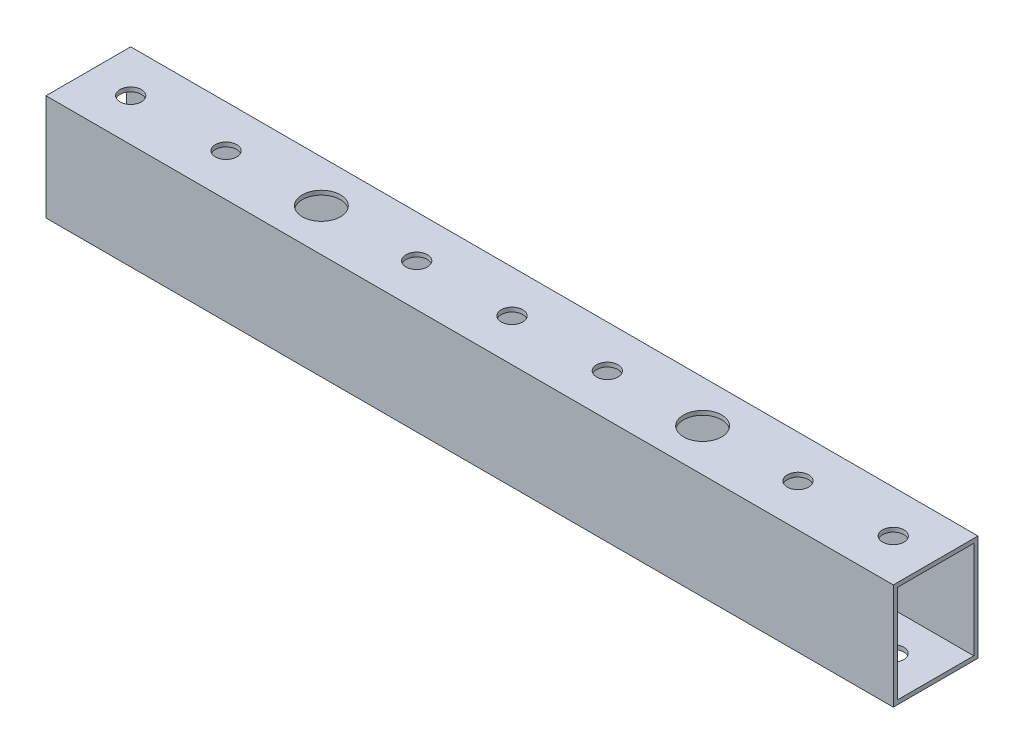
ISO-10303-21;
HEADER;
FILE_DESCRIPTION(('STEP AP214'),'2;1');
FILE_NAME('part.step','',(''),(''),'','','');
FILE_SCHEMA(('AUTOMOTIVE_DESIGN { 1 0 10303 214 1 1 1 1 }'));
ENDSEC;
DATA;
#1=APPLICATION_CONTEXT('core data for automotive mechanical design processes');
#2=APPLICATION_PROTOCOL_DEFINITION('international standard','automotive_design',2000,#1);
#3=PRODUCT_CONTEXT('',#1,'mechanical');
#4=PRODUCT('Part','Part','',(#3));
#5=PRODUCT_RELATED_PRODUCT_CATEGORY('part','',(#4));
#6=PRODUCT_DEFINITION_FORMATION('','',#4);
#7=PRODUCT_DEFINITION_CONTEXT('part definition',#1,'design');
#8=PRODUCT_DEFINITION('design','',#6,#7);
#9=PRODUCT_DEFINITION_SHAPE('','',#8);
#10=(LENGTH_UNIT() NAMED_UNIT(*) SI_UNIT(.MILLI.,.METRE.));
#11=(NAMED_UNIT(*) PLANE_ANGLE_UNIT() SI_UNIT($,.RADIAN.));
#12=(NAMED_UNIT(*) SI_UNIT($,.STERADIAN.) SOLID_ANGLE_UNIT());
#13=UNCERTAINTY_MEASURE_WITH_UNIT(LENGTH_MEASURE(1.E-05),#10,'distance_accuracy_value','');
#14=(GEOMETRIC_REPRESENTATION_CONTEXT(3) GLOBAL_UNCERTAINTY_ASSIGNED_CONTEXT((#13)) GLOBAL_UNIT_ASSIGNED_CONTEXT((#10,
#11,#12)) REPRESENTATION_CONTEXT('',''));
#15=CARTESIAN_POINT('',(0.,0.,0.));
#16=DIRECTION('',(0.,0.,1.));
#17=DIRECTION('',(1.,0.,0.));
#18=AXIS2_PLACEMENT_3D('',#15,#16,#17);
#19=CARTESIAN_POINT('',(100.,0.,0.));
#20=DIRECTION('',(1.,0.,0.));
#21=DIRECTION('',(0.,0.,-1.));
#22=AXIS2_PLACEMENT_3D('',#19,#20,#21);
#23=PLANE('',#22);
#24=DIRECTION('',(0.,0.,-1.));
#25=VECTOR('',#24,1.);
#26=CARTESIAN_POINT('',(100.,-12.5,10.));
#27=LINE('',#26,#25);
#28=CARTESIAN_POINT('',(100.,-12.5,10.));
#29=VERTEX_POINT('',#28);
#30=CARTESIAN_POINT('',(100.,-12.5,-10.));
#31=VERTEX_POINT('',#30);
#32=EDGE_CURVE('E143',#29,#31,#27,.T.);
#33=ORIENTED_EDGE('',*,*,#32,.T.);
#34=DIRECTION('',(0.,1.,0.));
#35=VECTOR('',#34,1.);
#36=CARTESIAN_POINT('',(100.,-12.5,-10.));
#37=LINE('',#36,#35);
#38=CARTESIAN_POINT('',(100.,12.5,-10.));
#39=VERTEX_POINT('',#38);
#40=EDGE_CURVE('E146',#31,#39,#37,.T.);
#41=ORIENTED_EDGE('',*,*,#40,.T.);
#42=DIRECTION('',(0.,0.,1.));
#43=VECTOR('',#42,1.);
#44=CARTESIAN_POINT('',(100.,12.5,10.));
#45=LINE('',#44,#43);
#46=CARTESIAN_POINT('',(100.,12.5,10.));
#47=VERTEX_POINT('',#46);
#48=EDGE_CURVE('E149',#39,#47,#45,.T.);
#49=ORIENTED_EDGE('',*,*,#48,.T.);
#50=DIRECTION('',(0.,-1.,0.));
#51=VECTOR('',#50,1.);
#52=CARTESIAN_POINT('',(100.,-12.5,10.));
#53=LINE('',#52,#51);
#54=EDGE_CURVE('E151',#47,#29,#53,.T.);
#55=ORIENTED_EDGE('',*,*,#54,.T.);
#56=EDGE_LOOP('',(#33,#41,#49,#55));
#57=FACE_BOUND('',#56,.T.);
#58=DIRECTION('',(0.,0.,1.));
#59=VECTOR('',#58,1.);
#60=CARTESIAN_POINT('',(100.,11.5,9.));
#61=LINE('',#60,#59);
#62=CARTESIAN_POINT('',(100.,11.5,-9.));
#63=VERTEX_POINT('',#62);
#64=CARTESIAN_POINT('',(100.,11.5,9.));
#65=VERTEX_POINT('',#64);
#66=EDGE_CURVE('E113',#63,#65,#61,.T.);
#67=ORIENTED_EDGE('',*,*,#66,.F.);
#68=DIRECTION('',(0.,1.,0.));
#69=VECTOR('',#68,1.);
#70=CARTESIAN_POINT('',(100.,-11.5,-9.));
#71=LINE('',#70,#69);
#72=CARTESIAN_POINT('',(100.,-11.5,-9.));
#73=VERTEX_POINT('',#72);
#74=EDGE_CURVE('E105',#73,#63,#71,.T.);
#75=ORIENTED_EDGE('',*,*,#74,.F.);
#76=DIRECTION('',(0.,0.,-1.));
#77=VECTOR('',#76,1.);
#78=CARTESIAN_POINT('',(100.,-11.5,9.));
#79=LINE('',#78,#77);
#80=CARTESIAN_POINT('',(100.,-11.5,9.));
#81=VERTEX_POINT('',#80);
#82=EDGE_CURVE('E127',#81,#73,#79,.T.);
#83=ORIENTED_EDGE('',*,*,#82,.F.);
#84=DIRECTION('',(0.,-1.,0.));
#85=VECTOR('',#84,1.);
#86=CARTESIAN_POINT('',(100.,-11.5,9.));
#87=LINE('',#86,#85);
#88=EDGE_CURVE('E125',#65,#81,#87,.T.);
#89=ORIENTED_EDGE('',*,*,#88,.F.);
#90=EDGE_LOOP('',(#67,#75,#83,#89));
#91=FACE_BOUND('',#90,.T.);
#92=ADVANCED_FACE('F38',(#57,#91),#23,.T.);
#93=CARTESIAN_POINT('',(-100.,0.,0.));
#94=DIRECTION('',(1.,0.,0.));
#95=DIRECTION('',(0.,0.,-1.));
#96=AXIS2_PLACEMENT_3D('',#93,#94,#95);
#97=PLANE('',#96);
#98=DIRECTION('',(0.,0.,-1.));
#99=VECTOR('',#98,1.);
#100=CARTESIAN_POINT('',(-100.,-12.5,10.));
#101=LINE('',#100,#99);
#102=CARTESIAN_POINT('',(-100.,-12.5,10.));
#103=VERTEX_POINT('',#102);
#104=CARTESIAN_POINT('',(-100.,-12.5,-10.));
#105=VERTEX_POINT('',#104);
#106=EDGE_CURVE('E121',#103,#105,#101,.T.);
#107=ORIENTED_EDGE('',*,*,#106,.F.);
#108=DIRECTION('',(0.,-1.,0.));
#109=VECTOR('',#108,1.);
#110=CARTESIAN_POINT('',(-100.,-12.5,10.));
#111=LINE('',#110,#109);
#112=CARTESIAN_POINT('',(-100.,12.5,10.));
#113=VERTEX_POINT('',#112);
#114=EDGE_CURVE('E147',#113,#103,#111,.T.);
#115=ORIENTED_EDGE('',*,*,#114,.F.);
#116=DIRECTION('',(0.,0.,1.));
#117=VECTOR('',#116,1.);
#118=CARTESIAN_POINT('',(-100.,12.5,10.));
#119=LINE('',#118,#117);
#120=CARTESIAN_POINT('',(-100.,12.5,-10.));
#121=VERTEX_POINT('',#120);
#122=EDGE_CURVE('E158',#121,#113,#119,.T.);
#123=ORIENTED_EDGE('',*,*,#122,.F.);
#124=DIRECTION('',(0.,1.,0.));
#125=VECTOR('',#124,1.);
#126=CARTESIAN_POINT('',(-100.,-12.5,-10.));
#127=LINE('',#126,#125);
#128=EDGE_CURVE('E156',#105,#121,#127,.T.);
#129=ORIENTED_EDGE('',*,*,#128,.F.);
#130=EDGE_LOOP('',(#107,#115,#123,#129));
#131=FACE_BOUND('',#130,.T.);
#132=DIRECTION('',(0.,1.,0.));
#133=VECTOR('',#132,1.);
#134=CARTESIAN_POINT('',(-100.,-11.5,-9.));
#135=LINE('',#134,#133);
#136=CARTESIAN_POINT('',(-100.,-11.5,-9.));
#137=VERTEX_POINT('',#136);
#138=CARTESIAN_POINT('',(-100.,11.5,-9.));
#139=VERTEX_POINT('',#138);
#140=EDGE_CURVE('E63',#137,#139,#135,.T.);
#141=ORIENTED_EDGE('',*,*,#140,.T.);
#142=DIRECTION('',(0.,0.,1.));
#143=VECTOR('',#142,1.);
#144=CARTESIAN_POINT('',(-100.,11.5,9.));
#145=LINE('',#144,#143);
#146=CARTESIAN_POINT('',(-100.,11.5,9.));
#147=VERTEX_POINT('',#146);
#148=EDGE_CURVE('E120',#139,#147,#145,.T.);
#149=ORIENTED_EDGE('',*,*,#148,.T.);
#150=DIRECTION('',(0.,-1.,0.));
#151=VECTOR('',#150,1.);
#152=CARTESIAN_POINT('',(-100.,-11.5,9.));
#153=LINE('',#152,#151);
#154=CARTESIAN_POINT('',(-100.,-11.5,9.));
#155=VERTEX_POINT('',#154);
#156=EDGE_CURVE('E135',#147,#155,#153,.T.);
#157=ORIENTED_EDGE('',*,*,#156,.T.);
#158=DIRECTION('',(0.,0.,-1.));
#159=VECTOR('',#158,1.);
#160=CARTESIAN_POINT('',(-100.,-11.5,9.));
#161=LINE('',#160,#159);
#162=EDGE_CURVE('E114',#155,#137,#161,.T.);
#163=ORIENTED_EDGE('',*,*,#162,.T.);
#164=EDGE_LOOP('',(#141,#149,#157,#163));
#165=FACE_BOUND('',#164,.T.);
#166=ADVANCED_FACE('F265',(#131,#165),#97,.F.);
#167=CARTESIAN_POINT('',(100.,-12.5,10.));
#168=DIRECTION('',(0.,1.,0.));
#169=DIRECTION('',(0.,0.,1.));
#170=AXIS2_PLACEMENT_3D('',#167,#168,#169);
#171=PLANE('',#170);
#172=CARTESIAN_POINT('',(-45.,-12.5,0.));
#173=DIRECTION('',(0.,1.,0.));
#174=DIRECTION('',(0.,0.,1.));
#175=AXIS2_PLACEMENT_3D('',#172,#173,#174);
#176=CIRCLE('',#175,2.525);
#177=CARTESIAN_POINT('',(-45.,-12.5,2.525));
#178=VERTEX_POINT('',#177);
#179=EDGE_CURVE('E224',#178,#178,#176,.T.);
#180=ORIENTED_EDGE('',*,*,#179,.T.);
#181=EDGE_LOOP('',(#180));
#182=FACE_BOUND('',#181,.T.);
#183=CARTESIAN_POINT('',(45.,-12.5,0.));
#184=DIRECTION('',(0.,1.,0.));
#185=DIRECTION('',(0.,0.,1.));
#186=AXIS2_PLACEMENT_3D('',#183,#184,#185);
#187=CIRCLE('',#186,2.525);
#188=CARTESIAN_POINT('',(45.,-12.5,2.52499999999998));
#189=VERTEX_POINT('',#188);
#190=EDGE_CURVE('E218',#189,#189,#187,.T.);
#191=ORIENTED_EDGE('',*,*,#190,.T.);
#192=EDGE_LOOP('',(#191));
#193=FACE_BOUND('',#192,.T.);
#194=CARTESIAN_POINT('',(-90.,-12.5,0.));
#195=DIRECTION('',(0.,1.,0.));
#196=DIRECTION('',(0.,0.,1.));
#197=AXIS2_PLACEMENT_3D('',#194,#195,#196);
#198=CIRCLE('',#197,2.5);
#199=CARTESIAN_POINT('',(-90.,-12.5,2.5));
#200=VERTEX_POINT('',#199);
#201=EDGE_CURVE('E172',#200,#200,#198,.T.);
#202=ORIENTED_EDGE('',*,*,#201,.T.);
#203=EDGE_LOOP('',(#202));
#204=FACE_BOUND('',#203,.T.);
#205=CARTESIAN_POINT('',(0.,-12.5,0.));
#206=DIRECTION('',(0.,1.,0.));
#207=DIRECTION('',(0.,0.,1.));
#208=AXIS2_PLACEMENT_3D('',#205,#206,#207);
#209=CIRCLE('',#208,2.5);
#210=CARTESIAN_POINT('',(0.,-12.5,2.5));
#211=VERTEX_POINT('',#210);
#212=EDGE_CURVE('E188',#211,#211,#209,.T.);
#213=ORIENTED_EDGE('',*,*,#212,.T.);
#214=EDGE_LOOP('',(#213));
#215=FACE_BOUND('',#214,.T.);
#216=CARTESIAN_POINT('',(90.,-12.5,0.));
#217=DIRECTION('',(0.,1.,0.));
#218=DIRECTION('',(0.,0.,1.));
#219=AXIS2_PLACEMENT_3D('',#216,#217,#218);
#220=CIRCLE('',#219,2.5);
#221=CARTESIAN_POINT('',(90.,-12.5,2.5));
#222=VERTEX_POINT('',#221);
#223=EDGE_CURVE('E183',#222,#222,#220,.T.);
#224=ORIENTED_EDGE('',*,*,#223,.T.);
#225=EDGE_LOOP('',(#224));
#226=FACE_BOUND('',#225,.T.);
#227=ORIENTED_EDGE('',*,*,#106,.T.);
#228=DIRECTION('',(-1.,0.,0.));
#229=VECTOR('',#228,1.);
#230=CARTESIAN_POINT('',(100.,-12.5,-10.));
#231=LINE('',#230,#229);
#232=EDGE_CURVE('E11',#31,#105,#231,.T.);
#233=ORIENTED_EDGE('',*,*,#232,.F.);
#234=ORIENTED_EDGE('',*,*,#32,.F.);
#235=DIRECTION('',(-1.,0.,0.));
#236=VECTOR('',#235,1.);
#237=CARTESIAN_POINT('',(100.,-12.5,10.));
#238=LINE('',#237,#236);
#239=EDGE_CURVE('E153',#29,#103,#238,.T.);
#240=ORIENTED_EDGE('',*,*,#239,.T.);
#241=EDGE_LOOP('',(#227,#233,#234,#240));
#242=FACE_BOUND('',#241,.T.);
#243=ADVANCED_FACE('F40',(#182,#193,#204,#215,#226,#242),#171,.F.);
#244=CARTESIAN_POINT('',(100.,-12.5,-10.));
#245=DIRECTION('',(0.,0.,1.));
#246=DIRECTION('',(1.,0.,0.));
#247=AXIS2_PLACEMENT_3D('',#244,#245,#246);
#248=PLANE('',#247);
#249=ORIENTED_EDGE('',*,*,#128,.T.);
#250=DIRECTION('',(-1.,0.,0.));
#251=VECTOR('',#250,1.);
#252=CARTESIAN_POINT('',(100.,12.5,-10.));
#253=LINE('',#252,#251);
#254=EDGE_CURVE('E47',#39,#121,#253,.T.);
#255=ORIENTED_EDGE('',*,*,#254,.F.);
#256=ORIENTED_EDGE('',*,*,#40,.F.);
#257=ORIENTED_EDGE('',*,*,#232,.T.);
#258=EDGE_LOOP('',(#249,#255,#256,#257));
#259=FACE_BOUND('',#258,.T.);
#260=ADVANCED_FACE('F281',(#259),#248,.F.);
#261=CARTESIAN_POINT('',(100.,12.5,10.));
#262=DIRECTION('',(0.,-1.,0.));
#263=DIRECTION('',(0.,0.,-1.));
#264=AXIS2_PLACEMENT_3D('',#261,#262,#263);
#265=PLANE('',#264);
#266=CARTESIAN_POINT('',(-67.5,12.5,0.));
#267=DIRECTION('',(0.,1.,0.));
#268=DIRECTION('',(0.,0.,1.));
#269=AXIS2_PLACEMENT_3D('',#266,#267,#268);
#270=CIRCLE('',#269,2.52499999999999);
#271=CARTESIAN_POINT('',(-67.5,12.5,2.52499999999999));
#272=VERTEX_POINT('',#271);
#273=EDGE_CURVE('E202',#272,#272,#270,.T.);
#274=ORIENTED_EDGE('',*,*,#273,.F.);
#275=EDGE_LOOP('',(#274));
#276=FACE_BOUND('',#275,.T.);
#277=CARTESIAN_POINT('',(-22.5,12.5,0.));
#278=DIRECTION('',(0.,1.,0.));
#279=DIRECTION('',(0.,0.,1.));
#280=AXIS2_PLACEMENT_3D('',#277,#278,#279);
#281=CIRCLE('',#280,2.52499999999999);
#282=CARTESIAN_POINT('',(-22.5,12.5,2.52499999999999));
#283=VERTEX_POINT('',#282);
#284=EDGE_CURVE('E480',#283,#283,#281,.T.);
#285=ORIENTED_EDGE('',*,*,#284,.F.);
#286=EDGE_LOOP('',(#285));
#287=FACE_BOUND('',#286,.T.);
#288=CARTESIAN_POINT('',(22.5,12.5,0.));
#289=DIRECTION('',(0.,1.,0.));
#290=DIRECTION('',(0.,0.,1.));
#291=AXIS2_PLACEMENT_3D('',#288,#289,#290);
#292=CIRCLE('',#291,2.52499999999999);
#293=CARTESIAN_POINT('',(22.5,12.5,2.52499999999999));
#294=VERTEX_POINT('',#293);
#295=EDGE_CURVE('E483',#294,#294,#292,.T.);
#296=ORIENTED_EDGE('',*,*,#295,.F.);
#297=EDGE_LOOP('',(#296));
#298=FACE_BOUND('',#297,.T.);
#299=CARTESIAN_POINT('',(67.5,12.5,0.));
#300=DIRECTION('',(0.,1.,0.));
#301=DIRECTION('',(0.,0.,1.));
#302=AXIS2_PLACEMENT_3D('',#299,#300,#301);
#303=CIRCLE('',#302,2.52499999999999);
#304=CARTESIAN_POINT('',(67.5,12.5,2.52499999999999));
#305=VERTEX_POINT('',#304);
#306=EDGE_CURVE('E487',#305,#305,#303,.T.);
#307=ORIENTED_EDGE('',*,*,#306,.F.);
#308=EDGE_LOOP('',(#307));
#309=FACE_BOUND('',#308,.T.);
#310=CARTESIAN_POINT('',(45.,12.5,0.));
#311=DIRECTION('',(0.,1.,0.));
#312=DIRECTION('',(0.,0.,1.));
#313=AXIS2_PLACEMENT_3D('',#310,#311,#312);
#314=CIRCLE('',#313,4.5);
#315=CARTESIAN_POINT('',(45.,12.5,4.49999999999998));
#316=VERTEX_POINT('',#315);
#317=EDGE_CURVE('E195',#316,#316,#314,.T.);
#318=ORIENTED_EDGE('',*,*,#317,.F.);
#319=EDGE_LOOP('',(#318));
#320=FACE_BOUND('',#319,.T.);
#321=CARTESIAN_POINT('',(-45.,12.5,0.));
#322=DIRECTION('',(0.,1.,0.));
#323=DIRECTION('',(0.,0.,1.));
#324=AXIS2_PLACEMENT_3D('',#321,#322,#323);
#325=CIRCLE('',#324,4.5);
#326=CARTESIAN_POINT('',(-45.,12.5,4.5));
#327=VERTEX_POINT('',#326);
#328=EDGE_CURVE('E227',#327,#327,#325,.T.);
#329=ORIENTED_EDGE('',*,*,#328,.F.);
#330=EDGE_LOOP('',(#329));
#331=FACE_BOUND('',#330,.T.);
#332=CARTESIAN_POINT('',(90.,12.5,0.));
#333=DIRECTION('',(0.,-1.,0.));
#334=DIRECTION('',(0.,0.,-1.));
#335=AXIS2_PLACEMENT_3D('',#332,#333,#334);
#336=CIRCLE('',#335,2.52499999999999);
#337=CARTESIAN_POINT('',(90.,12.5,-2.52499999999999));
#338=VERTEX_POINT('',#337);
#339=EDGE_CURVE('E133',#338,#338,#336,.T.);
#340=ORIENTED_EDGE('',*,*,#339,.T.);
#341=EDGE_LOOP('',(#340));
#342=FACE_BOUND('',#341,.T.);
#343=CARTESIAN_POINT('',(-90.,12.5,0.));
#344=DIRECTION('',(0.,-1.,0.));
#345=DIRECTION('',(0.,0.,-1.));
#346=AXIS2_PLACEMENT_3D('',#343,#344,#345);
#347=CIRCLE('',#346,2.52499999999999);
#348=CARTESIAN_POINT('',(-90.,12.5,-2.52499999999999));
#349=VERTEX_POINT('',#348);
#350=EDGE_CURVE('E176',#349,#349,#347,.T.);
#351=ORIENTED_EDGE('',*,*,#350,.T.);
#352=EDGE_LOOP('',(#351));
#353=FACE_BOUND('',#352,.T.);
#354=CARTESIAN_POINT('',(0.,12.5,0.));
#355=DIRECTION('',(0.,-1.,0.));
#356=DIRECTION('',(0.,0.,-1.));
#357=AXIS2_PLACEMENT_3D('',#354,#355,#356);
#358=CIRCLE('',#357,2.525);
#359=CARTESIAN_POINT('',(0.,12.5,-2.525));
#360=VERTEX_POINT('',#359);
#361=EDGE_CURVE('E171',#360,#360,#358,.T.);
#362=ORIENTED_EDGE('',*,*,#361,.T.);
#363=EDGE_LOOP('',(#362));
#364=FACE_BOUND('',#363,.T.);
#365=ORIENTED_EDGE('',*,*,#122,.T.);
#366=DIRECTION('',(-1.,0.,0.));
#367=VECTOR('',#366,1.);
#368=CARTESIAN_POINT('',(100.,12.5,10.));
#369=LINE('',#368,#367);
#370=EDGE_CURVE('E163',#47,#113,#369,.T.);
#371=ORIENTED_EDGE('',*,*,#370,.F.);
#372=ORIENTED_EDGE('',*,*,#48,.F.);
#373=ORIENTED_EDGE('',*,*,#254,.T.);
#374=EDGE_LOOP('',(#365,#371,#372,#373));
#375=FACE_BOUND('',#374,.T.);
#376=ADVANCED_FACE('F244',(#276,#287,#298,#309,#320,#331,#342,#353,#364,#375),#265,.F.);
#377=CARTESIAN_POINT('',(100.,-12.5,10.));
#378=DIRECTION('',(0.,0.,-1.));
#379=DIRECTION('',(-1.,0.,0.));
#380=AXIS2_PLACEMENT_3D('',#377,#378,#379);
#381=PLANE('',#380);
#382=ORIENTED_EDGE('',*,*,#114,.T.);
#383=ORIENTED_EDGE('',*,*,#239,.F.);
#384=ORIENTED_EDGE('',*,*,#54,.F.);
#385=ORIENTED_EDGE('',*,*,#370,.T.);
#386=EDGE_LOOP('',(#382,#383,#384,#385));
#387=FACE_BOUND('',#386,.T.);
#388=ADVANCED_FACE('F276',(#387),#381,.F.);
#389=CARTESIAN_POINT('',(100.,-11.5,-9.));
#390=DIRECTION('',(0.,0.,1.));
#391=DIRECTION('',(1.,0.,0.));
#392=AXIS2_PLACEMENT_3D('',#389,#390,#391);
#393=PLANE('',#392);
#394=ORIENTED_EDGE('',*,*,#140,.F.);
#395=DIRECTION('',(-1.,0.,0.));
#396=VECTOR('',#395,1.);
#397=CARTESIAN_POINT('',(100.,-11.5,-9.));
#398=LINE('',#397,#396);
#399=EDGE_CURVE('E109',#73,#137,#398,.T.);
#400=ORIENTED_EDGE('',*,*,#399,.F.);
#401=ORIENTED_EDGE('',*,*,#74,.T.);
#402=DIRECTION('',(-1.,0.,0.));
#403=VECTOR('',#402,1.);
#404=CARTESIAN_POINT('',(100.,11.5,-9.));
#405=LINE('',#404,#403);
#406=EDGE_CURVE('E108',#63,#139,#405,.T.);
#407=ORIENTED_EDGE('',*,*,#406,.T.);
#408=EDGE_LOOP('',(#394,#400,#401,#407));
#409=FACE_BOUND('',#408,.T.);
#410=ADVANCED_FACE('F107',(#409),#393,.T.);
#411=CARTESIAN_POINT('',(100.,11.5,9.));
#412=DIRECTION('',(0.,-1.,0.));
#413=DIRECTION('',(0.,0.,-1.));
#414=AXIS2_PLACEMENT_3D('',#411,#412,#413);
#415=PLANE('',#414);
#416=CARTESIAN_POINT('',(-67.5,11.5,0.));
#417=DIRECTION('',(0.,-1.,0.));
#418=DIRECTION('',(0.,0.,-1.));
#419=AXIS2_PLACEMENT_3D('',#416,#417,#418);
#420=CIRCLE('',#419,2.52499999999999);
#421=CARTESIAN_POINT('',(-67.5,11.5,-2.52499999999999));
#422=VERTEX_POINT('',#421);
#423=EDGE_CURVE('E42',#422,#422,#420,.T.);
#424=ORIENTED_EDGE('',*,*,#423,.F.);
#425=EDGE_LOOP('',(#424));
#426=FACE_BOUND('',#425,.T.);
#427=CARTESIAN_POINT('',(-22.5,11.5,0.));
#428=DIRECTION('',(0.,-1.,0.));
#429=DIRECTION('',(0.,0.,-1.));
#430=AXIS2_PLACEMENT_3D('',#427,#428,#429);
#431=CIRCLE('',#430,2.52499999999999);
#432=CARTESIAN_POINT('',(-22.5,11.5,-2.52499999999999));
#433=VERTEX_POINT('',#432);
#434=EDGE_CURVE('E204',#433,#433,#431,.T.);
#435=ORIENTED_EDGE('',*,*,#434,.F.);
#436=EDGE_LOOP('',(#435));
#437=FACE_BOUND('',#436,.T.);
#438=CARTESIAN_POINT('',(22.5,11.5,0.));
#439=DIRECTION('',(0.,-1.,0.));
#440=DIRECTION('',(0.,0.,-1.));
#441=AXIS2_PLACEMENT_3D('',#438,#439,#440);
#442=CIRCLE('',#441,2.52499999999999);
#443=CARTESIAN_POINT('',(22.5,11.5,-2.525));
#444=VERTEX_POINT('',#443);
#445=EDGE_CURVE('E201',#444,#444,#442,.T.);
#446=ORIENTED_EDGE('',*,*,#445,.F.);
#447=EDGE_LOOP('',(#446));
#448=FACE_BOUND('',#447,.T.);
#449=CARTESIAN_POINT('',(67.5,11.5,0.));
#450=DIRECTION('',(0.,-1.,0.));
#451=DIRECTION('',(0.,0.,-1.));
#452=AXIS2_PLACEMENT_3D('',#449,#450,#451);
#453=CIRCLE('',#452,2.52499999999999);
#454=CARTESIAN_POINT('',(67.5,11.5,-2.525));
#455=VERTEX_POINT('',#454);
#456=EDGE_CURVE('E198',#455,#455,#453,.T.);
#457=ORIENTED_EDGE('',*,*,#456,.F.);
#458=EDGE_LOOP('',(#457));
#459=FACE_BOUND('',#458,.T.);
#460=CARTESIAN_POINT('',(45.,11.5,0.));
#461=DIRECTION('',(0.,-1.,0.));
#462=DIRECTION('',(0.,0.,-1.));
#463=AXIS2_PLACEMENT_3D('',#460,#461,#462);
#464=CIRCLE('',#463,4.5);
#465=CARTESIAN_POINT('',(45.,11.5,-4.50000000000001));
#466=VERTEX_POINT('',#465);
#467=EDGE_CURVE('E184',#466,#466,#464,.T.);
#468=ORIENTED_EDGE('',*,*,#467,.F.);
#469=EDGE_LOOP('',(#468));
#470=FACE_BOUND('',#469,.T.);
#471=CARTESIAN_POINT('',(-45.,11.5,0.));
#472=DIRECTION('',(0.,-1.,0.));
#473=DIRECTION('',(0.,0.,-1.));
#474=AXIS2_PLACEMENT_3D('',#471,#472,#473);
#475=CIRCLE('',#474,4.5);
#476=CARTESIAN_POINT('',(-45.,11.5,-4.5));
#477=VERTEX_POINT('',#476);
#478=EDGE_CURVE('E192',#477,#477,#475,.T.);
#479=ORIENTED_EDGE('',*,*,#478,.F.);
#480=EDGE_LOOP('',(#479));
#481=FACE_BOUND('',#480,.T.);
#482=CARTESIAN_POINT('',(90.,11.5,0.));
#483=DIRECTION('',(0.,-1.,0.));
#484=DIRECTION('',(0.,0.,-1.));
#485=AXIS2_PLACEMENT_3D('',#482,#483,#484);
#486=CIRCLE('',#485,2.52499999999999);
#487=CARTESIAN_POINT('',(90.,11.5,-2.52499999999999));
#488=VERTEX_POINT('',#487);
#489=EDGE_CURVE('E177',#488,#488,#486,.T.);
#490=ORIENTED_EDGE('',*,*,#489,.F.);
#491=EDGE_LOOP('',(#490));
#492=FACE_BOUND('',#491,.T.);
#493=CARTESIAN_POINT('',(-90.,11.5,0.));
#494=DIRECTION('',(0.,-1.,0.));
#495=DIRECTION('',(0.,0.,-1.));
#496=AXIS2_PLACEMENT_3D('',#493,#494,#495);
#497=CIRCLE('',#496,2.52499999999999);
#498=CARTESIAN_POINT('',(-90.,11.5,-2.52499999999999));
#499=VERTEX_POINT('',#498);
#500=EDGE_CURVE('E173',#499,#499,#497,.T.);
#501=ORIENTED_EDGE('',*,*,#500,.F.);
#502=EDGE_LOOP('',(#501));
#503=FACE_BOUND('',#502,.T.);
#504=CARTESIAN_POINT('',(0.,11.5,0.));
#505=DIRECTION('',(0.,-1.,0.));
#506=DIRECTION('',(0.,0.,-1.));
#507=AXIS2_PLACEMENT_3D('',#504,#505,#506);
#508=CIRCLE('',#507,2.525);
#509=CARTESIAN_POINT('',(0.,11.5,-2.525));
#510=VERTEX_POINT('',#509);
#511=EDGE_CURVE('E168',#510,#510,#508,.T.);
#512=ORIENTED_EDGE('',*,*,#511,.F.);
#513=EDGE_LOOP('',(#512));
#514=FACE_BOUND('',#513,.T.);
#515=ORIENTED_EDGE('',*,*,#148,.F.);
#516=ORIENTED_EDGE('',*,*,#406,.F.);
#517=ORIENTED_EDGE('',*,*,#66,.T.);
#518=DIRECTION('',(-1.,0.,0.));
#519=VECTOR('',#518,1.);
#520=CARTESIAN_POINT('',(100.,11.5,9.));
#521=LINE('',#520,#519);
#522=EDGE_CURVE('E122',#65,#147,#521,.T.);
#523=ORIENTED_EDGE('',*,*,#522,.T.);
#524=EDGE_LOOP('',(#515,#516,#517,#523));
#525=FACE_BOUND('',#524,.T.);
#526=ADVANCED_FACE('F117',(#426,#437,#448,#459,#470,#481,#492,#503,#514,#525),#415,.T.);
#527=CARTESIAN_POINT('',(100.,-11.5,9.));
#528=DIRECTION('',(0.,0.,-1.));
#529=DIRECTION('',(-1.,0.,0.));
#530=AXIS2_PLACEMENT_3D('',#527,#528,#529);
#531=PLANE('',#530);
#532=ORIENTED_EDGE('',*,*,#156,.F.);
#533=ORIENTED_EDGE('',*,*,#522,.F.);
#534=ORIENTED_EDGE('',*,*,#88,.T.);
#535=DIRECTION('',(-1.,0.,0.));
#536=VECTOR('',#535,1.);
#537=CARTESIAN_POINT('',(100.,-11.5,9.));
#538=LINE('',#537,#536);
#539=EDGE_CURVE('E55',#81,#155,#538,.T.);
#540=ORIENTED_EDGE('',*,*,#539,.T.);
#541=EDGE_LOOP('',(#532,#533,#534,#540));
#542=FACE_BOUND('',#541,.T.);
#543=ADVANCED_FACE('F305',(#542),#531,.T.);
#544=CARTESIAN_POINT('',(100.,-11.5,9.));
#545=DIRECTION('',(0.,1.,0.));
#546=DIRECTION('',(0.,0.,1.));
#547=AXIS2_PLACEMENT_3D('',#544,#545,#546);
#548=PLANE('',#547);
#549=CARTESIAN_POINT('',(-45.,-11.5,0.));
#550=DIRECTION('',(0.,1.,0.));
#551=DIRECTION('',(0.,0.,1.));
#552=AXIS2_PLACEMENT_3D('',#549,#550,#551);
#553=CIRCLE('',#552,2.525);
#554=CARTESIAN_POINT('',(-45.,-11.5,2.525));
#555=VERTEX_POINT('',#554);
#556=EDGE_CURVE('E213',#555,#555,#553,.T.);
#557=ORIENTED_EDGE('',*,*,#556,.F.);
#558=EDGE_LOOP('',(#557));
#559=FACE_BOUND('',#558,.T.);
#560=CARTESIAN_POINT('',(45.,-11.5,0.));
#561=DIRECTION('',(0.,1.,0.));
#562=DIRECTION('',(0.,0.,1.));
#563=AXIS2_PLACEMENT_3D('',#560,#561,#562);
#564=CIRCLE('',#563,2.525);
#565=CARTESIAN_POINT('',(45.,-11.5,2.52499999999998));
#566=VERTEX_POINT('',#565);
#567=EDGE_CURVE('E209',#566,#566,#564,.T.);
#568=ORIENTED_EDGE('',*,*,#567,.F.);
#569=EDGE_LOOP('',(#568));
#570=FACE_BOUND('',#569,.T.);
#571=CARTESIAN_POINT('',(-90.,-11.5,0.));
#572=DIRECTION('',(0.,1.,0.));
#573=DIRECTION('',(0.,0.,1.));
#574=AXIS2_PLACEMENT_3D('',#571,#572,#573);
#575=CIRCLE('',#574,2.5);
#576=CARTESIAN_POINT('',(-90.,-11.5,2.5));
#577=VERTEX_POINT('',#576);
#578=EDGE_CURVE('E189',#577,#577,#575,.T.);
#579=ORIENTED_EDGE('',*,*,#578,.F.);
#580=EDGE_LOOP('',(#579));
#581=FACE_BOUND('',#580,.T.);
#582=CARTESIAN_POINT('',(0.,-11.5,0.));
#583=DIRECTION('',(0.,1.,0.));
#584=DIRECTION('',(0.,0.,1.));
#585=AXIS2_PLACEMENT_3D('',#582,#583,#584);
#586=CIRCLE('',#585,2.5);
#587=CARTESIAN_POINT('',(0.,-11.5,2.5));
#588=VERTEX_POINT('',#587);
#589=EDGE_CURVE('E185',#588,#588,#586,.T.);
#590=ORIENTED_EDGE('',*,*,#589,.F.);
#591=EDGE_LOOP('',(#590));
#592=FACE_BOUND('',#591,.T.);
#593=CARTESIAN_POINT('',(90.,-11.5,0.));
#594=DIRECTION('',(0.,1.,0.));
#595=DIRECTION('',(0.,0.,1.));
#596=AXIS2_PLACEMENT_3D('',#593,#594,#595);
#597=CIRCLE('',#596,2.5);
#598=CARTESIAN_POINT('',(90.,-11.5,2.5));
#599=VERTEX_POINT('',#598);
#600=EDGE_CURVE('E180',#599,#599,#597,.T.);
#601=ORIENTED_EDGE('',*,*,#600,.F.);
#602=EDGE_LOOP('',(#601));
#603=FACE_BOUND('',#602,.T.);
#604=ORIENTED_EDGE('',*,*,#162,.F.);
#605=ORIENTED_EDGE('',*,*,#539,.F.);
#606=ORIENTED_EDGE('',*,*,#82,.T.);
#607=ORIENTED_EDGE('',*,*,#399,.T.);
#608=EDGE_LOOP('',(#604,#605,#606,#607));
#609=FACE_BOUND('',#608,.T.);
#610=ADVANCED_FACE('F303',(#559,#570,#581,#592,#603,#609),#548,.T.);
#611=CARTESIAN_POINT('',(0.,7.5,0.));
#612=DIRECTION('',(0.,1.,0.));
#613=DIRECTION('',(0.,0.,1.));
#614=AXIS2_PLACEMENT_3D('',#611,#612,#613);
#615=CYLINDRICAL_SURFACE('',#614,2.525);
#616=ORIENTED_EDGE('',*,*,#511,.T.);
#617=EDGE_LOOP('',(#616));
#618=FACE_BOUND('',#617,.T.);
#619=ORIENTED_EDGE('',*,*,#361,.F.);
#620=EDGE_LOOP('',(#619));
#621=FACE_BOUND('',#620,.T.);
#622=ADVANCED_FACE('F260',(#618,#621),#615,.F.);
#623=CARTESIAN_POINT('',(-90.,7.5,0.));
#624=DIRECTION('',(0.,1.,0.));
#625=DIRECTION('',(0.,0.,1.));
#626=AXIS2_PLACEMENT_3D('',#623,#624,#625);
#627=CYLINDRICAL_SURFACE('',#626,2.52499999999999);
#628=ORIENTED_EDGE('',*,*,#500,.T.);
#629=EDGE_LOOP('',(#628));
#630=FACE_BOUND('',#629,.T.);
#631=ORIENTED_EDGE('',*,*,#350,.F.);
#632=EDGE_LOOP('',(#631));
#633=FACE_BOUND('',#632,.T.);
#634=ADVANCED_FACE('F250',(#630,#633),#627,.F.);
#635=CARTESIAN_POINT('',(90.,7.5,0.));
#636=DIRECTION('',(0.,1.,0.));
#637=DIRECTION('',(0.,0.,1.));
#638=AXIS2_PLACEMENT_3D('',#635,#636,#637);
#639=CYLINDRICAL_SURFACE('',#638,2.52499999999999);
#640=ORIENTED_EDGE('',*,*,#489,.T.);
#641=EDGE_LOOP('',(#640));
#642=FACE_BOUND('',#641,.T.);
#643=ORIENTED_EDGE('',*,*,#339,.F.);
#644=EDGE_LOOP('',(#643));
#645=FACE_BOUND('',#644,.T.);
#646=ADVANCED_FACE('F247',(#642,#645),#639,.F.);
#647=CARTESIAN_POINT('',(90.,-16.5,0.));
#648=DIRECTION('',(0.,1.,0.));
#649=DIRECTION('',(0.,0.,1.));
#650=AXIS2_PLACEMENT_3D('',#647,#648,#649);
#651=CYLINDRICAL_SURFACE('',#650,2.5);
#652=ORIENTED_EDGE('',*,*,#600,.T.);
#653=EDGE_LOOP('',(#652));
#654=FACE_BOUND('',#653,.T.);
#655=ORIENTED_EDGE('',*,*,#223,.F.);
#656=EDGE_LOOP('',(#655));
#657=FACE_BOUND('',#656,.T.);
#658=ADVANCED_FACE('F249',(#654,#657),#651,.F.);
#659=CARTESIAN_POINT('',(0.,-16.5,0.));
#660=DIRECTION('',(0.,1.,0.));
#661=DIRECTION('',(0.,0.,1.));
#662=AXIS2_PLACEMENT_3D('',#659,#660,#661);
#663=CYLINDRICAL_SURFACE('',#662,2.5);
#664=ORIENTED_EDGE('',*,*,#589,.T.);
#665=EDGE_LOOP('',(#664));
#666=FACE_BOUND('',#665,.T.);
#667=ORIENTED_EDGE('',*,*,#212,.F.);
#668=EDGE_LOOP('',(#667));
#669=FACE_BOUND('',#668,.T.);
#670=ADVANCED_FACE('F257',(#666,#669),#663,.F.);
#671=CARTESIAN_POINT('',(-90.,-16.5,0.));
#672=DIRECTION('',(0.,1.,0.));
#673=DIRECTION('',(0.,0.,1.));
#674=AXIS2_PLACEMENT_3D('',#671,#672,#673);
#675=CYLINDRICAL_SURFACE('',#674,2.5);
#676=ORIENTED_EDGE('',*,*,#578,.T.);
#677=EDGE_LOOP('',(#676));
#678=FACE_BOUND('',#677,.T.);
#679=ORIENTED_EDGE('',*,*,#201,.F.);
#680=EDGE_LOOP('',(#679));
#681=FACE_BOUND('',#680,.T.);
#682=ADVANCED_FACE('F347',(#678,#681),#675,.F.);
#683=CARTESIAN_POINT('',(-45.,10.5,0.));
#684=DIRECTION('',(0.,1.,0.));
#685=DIRECTION('',(0.,0.,1.));
#686=AXIS2_PLACEMENT_3D('',#683,#684,#685);
#687=CYLINDRICAL_SURFACE('',#686,4.5);
#688=ORIENTED_EDGE('',*,*,#478,.T.);
#689=EDGE_LOOP('',(#688));
#690=FACE_BOUND('',#689,.T.);
#691=ORIENTED_EDGE('',*,*,#328,.T.);
#692=EDGE_LOOP('',(#691));
#693=FACE_BOUND('',#692,.T.);
#694=ADVANCED_FACE('F343',(#690,#693),#687,.F.);
#695=CARTESIAN_POINT('',(45.,10.5,0.));
#696=DIRECTION('',(0.,1.,0.));
#697=DIRECTION('',(0.,0.,1.));
#698=AXIS2_PLACEMENT_3D('',#695,#696,#697);
#699=CYLINDRICAL_SURFACE('',#698,4.5);
#700=ORIENTED_EDGE('',*,*,#467,.T.);
#701=EDGE_LOOP('',(#700));
#702=FACE_BOUND('',#701,.T.);
#703=ORIENTED_EDGE('',*,*,#317,.T.);
#704=EDGE_LOOP('',(#703));
#705=FACE_BOUND('',#704,.T.);
#706=ADVANCED_FACE('F346',(#702,#705),#699,.F.);
#707=CARTESIAN_POINT('',(45.,-13.5,0.));
#708=DIRECTION('',(0.,1.,0.));
#709=DIRECTION('',(0.,0.,1.));
#710=AXIS2_PLACEMENT_3D('',#707,#708,#709);
#711=CYLINDRICAL_SURFACE('',#710,2.525);
#712=ORIENTED_EDGE('',*,*,#567,.T.);
#713=EDGE_LOOP('',(#712));
#714=FACE_BOUND('',#713,.T.);
#715=ORIENTED_EDGE('',*,*,#190,.F.);
#716=EDGE_LOOP('',(#715));
#717=FACE_BOUND('',#716,.T.);
#718=ADVANCED_FACE('F355',(#714,#717),#711,.F.);
#719=CARTESIAN_POINT('',(-45.,-13.5,0.));
#720=DIRECTION('',(0.,1.,0.));
#721=DIRECTION('',(0.,0.,1.));
#722=AXIS2_PLACEMENT_3D('',#719,#720,#721);
#723=CYLINDRICAL_SURFACE('',#722,2.525);
#724=ORIENTED_EDGE('',*,*,#556,.T.);
#725=EDGE_LOOP('',(#724));
#726=FACE_BOUND('',#725,.T.);
#727=ORIENTED_EDGE('',*,*,#179,.F.);
#728=EDGE_LOOP('',(#727));
#729=FACE_BOUND('',#728,.T.);
#730=ADVANCED_FACE('F415',(#726,#729),#723,.F.);
#731=CARTESIAN_POINT('',(67.5,2.5,0.));
#732=DIRECTION('',(0.,1.,0.));
#733=DIRECTION('',(0.,0.,1.));
#734=AXIS2_PLACEMENT_3D('',#731,#732,#733);
#735=CYLINDRICAL_SURFACE('',#734,2.52499999999999);
#736=ORIENTED_EDGE('',*,*,#456,.T.);
#737=EDGE_LOOP('',(#736));
#738=FACE_BOUND('',#737,.T.);
#739=ORIENTED_EDGE('',*,*,#306,.T.);
#740=EDGE_LOOP('',(#739));
#741=FACE_BOUND('',#740,.T.);
#742=ADVANCED_FACE('F423',(#738,#741),#735,.F.);
#743=CARTESIAN_POINT('',(22.5,2.5,0.));
#744=DIRECTION('',(0.,1.,0.));
#745=DIRECTION('',(0.,0.,1.));
#746=AXIS2_PLACEMENT_3D('',#743,#744,#745);
#747=CYLINDRICAL_SURFACE('',#746,2.52499999999999);
#748=ORIENTED_EDGE('',*,*,#445,.T.);
#749=EDGE_LOOP('',(#748));
#750=FACE_BOUND('',#749,.T.);
#751=ORIENTED_EDGE('',*,*,#295,.T.);
#752=EDGE_LOOP('',(#751));
#753=FACE_BOUND('',#752,.T.);
#754=ADVANCED_FACE('F445',(#750,#753),#747,.F.);
#755=CARTESIAN_POINT('',(-22.5,2.5,0.));
#756=DIRECTION('',(0.,1.,0.));
#757=DIRECTION('',(0.,0.,1.));
#758=AXIS2_PLACEMENT_3D('',#755,#756,#757);
#759=CYLINDRICAL_SURFACE('',#758,2.52499999999999);
#760=ORIENTED_EDGE('',*,*,#434,.T.);
#761=EDGE_LOOP('',(#760));
#762=FACE_BOUND('',#761,.T.);
#763=ORIENTED_EDGE('',*,*,#284,.T.);
#764=EDGE_LOOP('',(#763));
#765=FACE_BOUND('',#764,.T.);
#766=ADVANCED_FACE('F455',(#762,#765),#759,.F.);
#767=CARTESIAN_POINT('',(-67.5,2.5,0.));
#768=DIRECTION('',(0.,1.,0.));
#769=DIRECTION('',(0.,0.,1.));
#770=AXIS2_PLACEMENT_3D('',#767,#768,#769);
#771=CYLINDRICAL_SURFACE('',#770,2.52499999999999);
#772=ORIENTED_EDGE('',*,*,#423,.T.);
#773=EDGE_LOOP('',(#772));
#774=FACE_BOUND('',#773,.T.);
#775=ORIENTED_EDGE('',*,*,#273,.T.);
#776=EDGE_LOOP('',(#775));
#777=FACE_BOUND('',#776,.T.);
#778=ADVANCED_FACE('F465',(#774,#777),#771,.F.);
#779=CLOSED_SHELL('',(#92,#166,#243,#260,#376,#388,#410,#526,#543,#610,#622,#634,#646,#658,#670,
#682,#694,#706,#718,#730,#742,#754,#766,#778));
#780=MANIFOLD_SOLID_BREP('B2',#779);
#781=ADVANCED_BREP_SHAPE_REPRESENTATION('',(#18,#780),#14);
#782=SHAPE_DEFINITION_REPRESENTATION(#9,#781);
ENDSEC;
END-ISO-10303-21;
